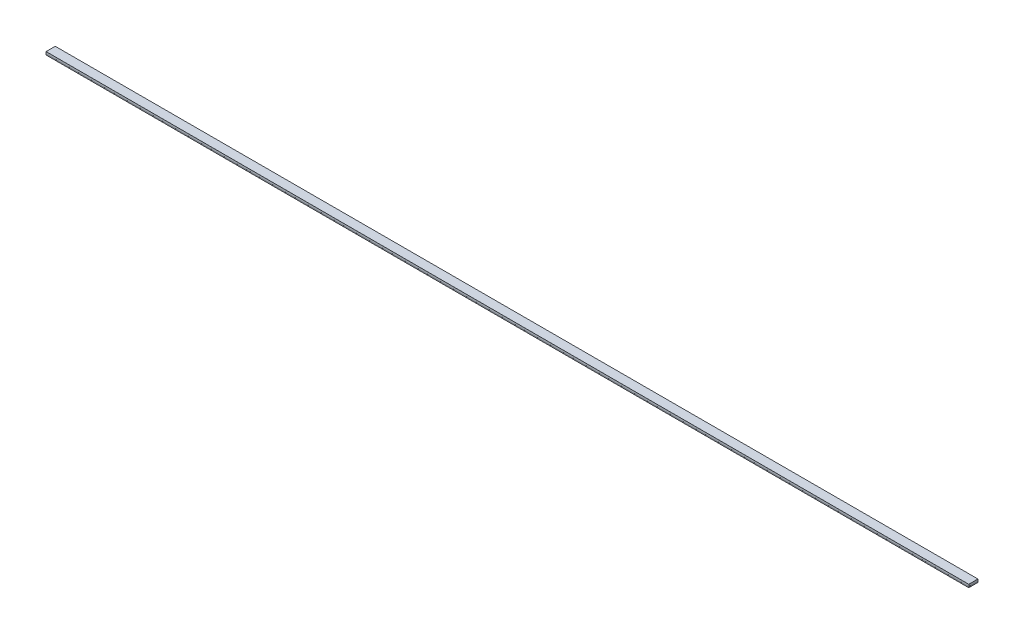
ISO-10303-21;
HEADER;
FILE_DESCRIPTION(('STEP AP214'),'2;1');
FILE_NAME('part.step','',(''),(''),'','','');
FILE_SCHEMA(('AUTOMOTIVE_DESIGN { 1 0 10303 214 1 1 1 1 }'));
ENDSEC;
DATA;
#1=APPLICATION_CONTEXT('core data for automotive mechanical design processes');
#2=APPLICATION_PROTOCOL_DEFINITION('international standard','automotive_design',2000,#1);
#3=PRODUCT_CONTEXT('',#1,'mechanical');
#4=PRODUCT('Part','Part','',(#3));
#5=PRODUCT_RELATED_PRODUCT_CATEGORY('part','',(#4));
#6=PRODUCT_DEFINITION_FORMATION('','',#4);
#7=PRODUCT_DEFINITION_CONTEXT('part definition',#1,'design');
#8=PRODUCT_DEFINITION('design','',#6,#7);
#9=PRODUCT_DEFINITION_SHAPE('','',#8);
#10=(LENGTH_UNIT() NAMED_UNIT(*) SI_UNIT(.MILLI.,.METRE.));
#11=(NAMED_UNIT(*) PLANE_ANGLE_UNIT() SI_UNIT($,.RADIAN.));
#12=(NAMED_UNIT(*) SI_UNIT($,.STERADIAN.) SOLID_ANGLE_UNIT());
#13=UNCERTAINTY_MEASURE_WITH_UNIT(LENGTH_MEASURE(1.E-05),#10,'distance_accuracy_value','');
#14=(GEOMETRIC_REPRESENTATION_CONTEXT(3) GLOBAL_UNCERTAINTY_ASSIGNED_CONTEXT((#13)) GLOBAL_UNIT_ASSIGNED_CONTEXT((#10,
#11,#12)) REPRESENTATION_CONTEXT('',''));
#15=CARTESIAN_POINT('',(0.,0.,0.));
#16=DIRECTION('',(0.,0.,1.));
#17=DIRECTION('',(1.,0.,0.));
#18=AXIS2_PLACEMENT_3D('',#15,#16,#17);
#19=CARTESIAN_POINT('',(0.,1.3,-5.));
#20=DIRECTION('',(0.,-1.,0.));
#21=DIRECTION('',(0.,0.,-1.));
#22=AXIS2_PLACEMENT_3D('',#19,#20,#21);
#23=PLANE('',#22);
#24=DIRECTION('',(0.,0.,-1.));
#25=VECTOR('',#24,1.);
#26=CARTESIAN_POINT('',(499.98,1.3,-0.02));
#27=LINE('',#26,#25);
#28=CARTESIAN_POINT('',(499.985,1.3,-0.0150000000000011));
#29=VERTEX_POINT('',#28);
#30=CARTESIAN_POINT('',(499.98,1.3,-4.98));
#31=VERTEX_POINT('',#30);
#32=EDGE_CURVE('E73',#29,#31,#27,.T.);
#33=ORIENTED_EDGE('',*,*,#32,.F.);
#34=DIRECTION('',(0.,0.,-1.));
#35=VECTOR('',#34,1.);
#36=CARTESIAN_POINT('',(499.99,1.3,-0.01));
#37=LINE('',#36,#35);
#38=CARTESIAN_POINT('',(499.99,1.3,-4.99));
#39=VERTEX_POINT('',#38);
#40=EDGE_CURVE('E136',#29,#39,#37,.T.);
#41=ORIENTED_EDGE('',*,*,#40,.T.);
#42=DIRECTION('',(-1.,0.,0.));
#43=VECTOR('',#42,1.);
#44=CARTESIAN_POINT('',(499.99,1.3,-4.99));
#45=LINE('',#44,#43);
#46=CARTESIAN_POINT('',(0.0164644660940719,1.3,-4.98353553390593));
#47=VERTEX_POINT('',#46);
#48=EDGE_CURVE('E159',#39,#47,#45,.T.);
#49=ORIENTED_EDGE('',*,*,#48,.T.);
#50=DIRECTION('',(-1.,0.,0.));
#51=VECTOR('',#50,1.);
#52=CARTESIAN_POINT('',(499.98,1.3,-4.98));
#53=LINE('',#52,#51);
#54=EDGE_CURVE('E62',#31,#47,#53,.T.);
#55=ORIENTED_EDGE('',*,*,#54,.F.);
#56=EDGE_LOOP('',(#33,#41,#49,#55));
#57=FACE_BOUND('',#56,.T.);
#58=ADVANCED_FACE('F40',(#57),#23,.F.);
#59=CARTESIAN_POINT('',(0.,1.3,0.));
#60=DIRECTION('',(1.,0.,0.));
#61=DIRECTION('',(0.,0.,-1.));
#62=AXIS2_PLACEMENT_3D('',#59,#60,#61);
#63=PLANE('',#62);
#64=DIRECTION('',(0.,0.,1.));
#65=VECTOR('',#64,1.);
#66=CARTESIAN_POINT('',(0.,0.3,0.));
#67=LINE('',#66,#65);
#68=CARTESIAN_POINT('',(0.,0.3,-5.));
#69=VERTEX_POINT('',#68);
#70=CARTESIAN_POINT('',(0.,0.3,0.));
#71=VERTEX_POINT('',#70);
#72=EDGE_CURVE('E233',#69,#71,#67,.T.);
#73=ORIENTED_EDGE('',*,*,#72,.F.);
#74=DIRECTION('',(0.,-1.,0.));
#75=VECTOR('',#74,1.);
#76=CARTESIAN_POINT('',(0.,1.3,-5.));
#77=LINE('',#76,#75);
#78=CARTESIAN_POINT('',(0.005,0.,-4.995));
#79=VERTEX_POINT('',#78);
#80=EDGE_CURVE('E290',#69,#79,#77,.T.);
#81=ORIENTED_EDGE('',*,*,#80,.T.);
#82=CARTESIAN_POINT('',(0.,0.,-5.));
#83=DIRECTION('',(0.,0.,1.));
#84=VECTOR('',#83,1.);
#85=LINE('',#82,#84);
#86=CARTESIAN_POINT('',(0.005,0.,-0.005));
#87=VERTEX_POINT('',#86);
#88=EDGE_CURVE('E234',#79,#87,#85,.T.);
#89=ORIENTED_EDGE('',*,*,#88,.T.);
#90=DIRECTION('',(0.,-1.,0.));
#91=VECTOR('',#90,1.);
#92=CARTESIAN_POINT('',(0.,1.3,0.));
#93=LINE('',#92,#91);
#94=EDGE_CURVE('E53',#71,#87,#93,.T.);
#95=ORIENTED_EDGE('',*,*,#94,.F.);
#96=EDGE_LOOP('',(#73,#81,#89,#95));
#97=FACE_BOUND('',#96,.T.);
#98=ADVANCED_FACE('F42',(#97),#63,.F.);
#99=CARTESIAN_POINT('',(0.,1.3,0.));
#100=DIRECTION('',(0.,0.,-1.));
#101=DIRECTION('',(-1.,0.,0.));
#102=AXIS2_PLACEMENT_3D('',#99,#100,#101);
#103=PLANE('',#102);
#104=DIRECTION('',(1.,0.,0.));
#105=VECTOR('',#104,1.);
#106=CARTESIAN_POINT('',(0.,0.3,0.));
#107=LINE('',#106,#105);
#108=CARTESIAN_POINT('',(500.,0.3,0.));
#109=VERTEX_POINT('',#108);
#110=EDGE_CURVE('E231',#71,#109,#107,.T.);
#111=ORIENTED_EDGE('',*,*,#110,.F.);
#112=ORIENTED_EDGE('',*,*,#94,.T.);
#113=CARTESIAN_POINT('',(0.,0.,0.));
#114=DIRECTION('',(1.,0.,0.));
#115=VECTOR('',#114,1.);
#116=LINE('',#113,#115);
#117=CARTESIAN_POINT('',(499.993535533906,0.,-0.00646446609407217));
#118=VERTEX_POINT('',#117);
#119=EDGE_CURVE('E297',#87,#118,#116,.T.);
#120=ORIENTED_EDGE('',*,*,#119,.T.);
#121=DIRECTION('',(0.,-1.,0.));
#122=VECTOR('',#121,1.);
#123=CARTESIAN_POINT('',(500.,1.3,0.));
#124=LINE('',#123,#122);
#125=EDGE_CURVE('E289',#109,#118,#124,.T.);
#126=ORIENTED_EDGE('',*,*,#125,.F.);
#127=EDGE_LOOP('',(#111,#112,#120,#126));
#128=FACE_BOUND('',#127,.T.);
#129=ADVANCED_FACE('F311',(#128),#103,.F.);
#130=CARTESIAN_POINT('',(500.,1.3,0.));
#131=DIRECTION('',(-1.,0.,0.));
#132=DIRECTION('',(0.,0.,1.));
#133=AXIS2_PLACEMENT_3D('',#130,#131,#132);
#134=PLANE('',#133);
#135=DIRECTION('',(0.,0.,-1.));
#136=VECTOR('',#135,1.);
#137=CARTESIAN_POINT('',(500.,0.3,0.));
#138=LINE('',#137,#136);
#139=CARTESIAN_POINT('',(500.,0.3,-5.));
#140=VERTEX_POINT('',#139);
#141=EDGE_CURVE('E229',#109,#140,#138,.T.);
#142=ORIENTED_EDGE('',*,*,#141,.F.);
#143=ORIENTED_EDGE('',*,*,#125,.T.);
#144=DIRECTION('',(0.,0.,-1.));
#145=VECTOR('',#144,1.);
#146=CARTESIAN_POINT('',(500.,0.,0.));
#147=LINE('',#146,#145);
#148=CARTESIAN_POINT('',(499.995,0.,-4.995));
#149=VERTEX_POINT('',#148);
#150=EDGE_CURVE('E293',#118,#149,#147,.T.);
#151=ORIENTED_EDGE('',*,*,#150,.T.);
#152=DIRECTION('',(0.,-1.,0.));
#153=VECTOR('',#152,1.);
#154=CARTESIAN_POINT('',(500.,1.3,-5.));
#155=LINE('',#154,#153);
#156=EDGE_CURVE('E281',#140,#149,#155,.T.);
#157=ORIENTED_EDGE('',*,*,#156,.F.);
#158=EDGE_LOOP('',(#142,#143,#151,#157));
#159=FACE_BOUND('',#158,.T.);
#160=ADVANCED_FACE('F272',(#159),#134,.F.);
#161=CARTESIAN_POINT('',(0.,1.3,-5.));
#162=DIRECTION('',(0.,0.,1.));
#163=DIRECTION('',(1.,0.,0.));
#164=AXIS2_PLACEMENT_3D('',#161,#162,#163);
#165=PLANE('',#164);
#166=DIRECTION('',(-1.,0.,0.));
#167=VECTOR('',#166,1.);
#168=CARTESIAN_POINT('',(0.,0.3,-5.));
#169=LINE('',#168,#167);
#170=EDGE_CURVE('E12',#140,#69,#169,.T.);
#171=ORIENTED_EDGE('',*,*,#170,.F.);
#172=ORIENTED_EDGE('',*,*,#156,.T.);
#173=CARTESIAN_POINT('',(500.,0.,-5.));
#174=DIRECTION('',(-1.,0.,0.));
#175=VECTOR('',#174,1.);
#176=LINE('',#173,#175);
#177=EDGE_CURVE('E296',#149,#79,#176,.T.);
#178=ORIENTED_EDGE('',*,*,#177,.T.);
#179=ORIENTED_EDGE('',*,*,#80,.F.);
#180=EDGE_LOOP('',(#171,#172,#178,#179));
#181=FACE_BOUND('',#180,.T.);
#182=ADVANCED_FACE('F267',(#181),#165,.F.);
#183=CARTESIAN_POINT('',(0.,0.,-5.));
#184=DIRECTION('',(0.,-1.,0.));
#185=DIRECTION('',(0.,0.,-1.));
#186=AXIS2_PLACEMENT_3D('',#183,#184,#185);
#187=PLANE('',#186);
#188=DIRECTION('',(0.,0.,1.));
#189=VECTOR('',#188,1.);
#190=CARTESIAN_POINT('',(499.99,0.,-4.99));
#191=LINE('',#190,#189);
#192=EDGE_CURVE('E467',#149,#118,#191,.T.);
#193=ORIENTED_EDGE('',*,*,#192,.F.);
#194=ORIENTED_EDGE('',*,*,#150,.F.);
#195=EDGE_LOOP('',(#193,#194));
#196=FACE_BOUND('',#195,.T.);
#197=ADVANCED_FACE('F261',(#196),#187,.T.);
#198=CARTESIAN_POINT('',(250.,0.3,-2.5));
#199=DIRECTION('',(0.,1.,0.));
#200=DIRECTION('',(0.,0.,1.));
#201=AXIS2_PLACEMENT_3D('',#198,#199,#200);
#202=PLANE('',#201);
#203=DIRECTION('',(0.,0.,-1.));
#204=VECTOR('',#203,1.);
#205=CARTESIAN_POINT('',(499.99,0.3,-0.01));
#206=LINE('',#205,#204);
#207=CARTESIAN_POINT('',(499.99,0.3,-0.01));
#208=VERTEX_POINT('',#207);
#209=CARTESIAN_POINT('',(499.99,0.3,-4.99));
#210=VERTEX_POINT('',#209);
#211=EDGE_CURVE('E224',#208,#210,#206,.T.);
#212=ORIENTED_EDGE('',*,*,#211,.F.);
#213=DIRECTION('',(1.,0.,0.));
#214=VECTOR('',#213,1.);
#215=CARTESIAN_POINT('',(0.01,0.3,-0.01));
#216=LINE('',#215,#214);
#217=CARTESIAN_POINT('',(0.01000000000001,0.3,-0.01));
#218=VERTEX_POINT('',#217);
#219=EDGE_CURVE('E222',#218,#208,#216,.T.);
#220=ORIENTED_EDGE('',*,*,#219,.F.);
#221=DIRECTION('',(0.,0.,1.));
#222=VECTOR('',#221,1.);
#223=CARTESIAN_POINT('',(0.01,0.3,-4.99));
#224=LINE('',#223,#222);
#225=CARTESIAN_POINT('',(0.01,0.3,-4.99));
#226=VERTEX_POINT('',#225);
#227=EDGE_CURVE('E147',#226,#218,#224,.T.);
#228=ORIENTED_EDGE('',*,*,#227,.F.);
#229=DIRECTION('',(-1.,0.,0.));
#230=VECTOR('',#229,1.);
#231=CARTESIAN_POINT('',(499.99,0.3,-4.99));
#232=LINE('',#231,#230);
#233=EDGE_CURVE('E218',#210,#226,#232,.T.);
#234=ORIENTED_EDGE('',*,*,#233,.F.);
#235=EDGE_LOOP('',(#212,#220,#228,#234));
#236=FACE_BOUND('',#235,.T.);
#237=ORIENTED_EDGE('',*,*,#72,.T.);
#238=ORIENTED_EDGE('',*,*,#110,.T.);
#239=ORIENTED_EDGE('',*,*,#141,.T.);
#240=ORIENTED_EDGE('',*,*,#170,.T.);
#241=EDGE_LOOP('',(#237,#238,#239,#240));
#242=FACE_BOUND('',#241,.T.);
#243=ADVANCED_FACE('F257',(#236,#242),#202,.T.);
#244=CARTESIAN_POINT('',(499.99,0.3,-4.99));
#245=DIRECTION('',(0.,0.,-1.));
#246=DIRECTION('',(-1.,0.,0.));
#247=AXIS2_PLACEMENT_3D('',#244,#245,#246);
#248=PLANE('',#247);
#249=ORIENTED_EDGE('',*,*,#48,.F.);
#250=DIRECTION('',(0.,1.,0.));
#251=VECTOR('',#250,1.);
#252=CARTESIAN_POINT('',(499.99,0.3,-4.99));
#253=LINE('',#252,#251);
#254=EDGE_CURVE('E227',#210,#39,#253,.T.);
#255=ORIENTED_EDGE('',*,*,#254,.F.);
#256=ORIENTED_EDGE('',*,*,#233,.T.);
#257=DIRECTION('',(0.,1.,0.));
#258=VECTOR('',#257,1.);
#259=CARTESIAN_POINT('',(0.01,0.3,-4.99));
#260=LINE('',#259,#258);
#261=EDGE_CURVE('E148',#226,#47,#260,.T.);
#262=ORIENTED_EDGE('',*,*,#261,.T.);
#263=EDGE_LOOP('',(#249,#255,#256,#262));
#264=FACE_BOUND('',#263,.T.);
#265=ADVANCED_FACE('F253',(#264),#248,.T.);
#266=CARTESIAN_POINT('',(499.99,0.3,-0.01));
#267=DIRECTION('',(1.,0.,0.));
#268=DIRECTION('',(0.,0.,-1.));
#269=AXIS2_PLACEMENT_3D('',#266,#267,#268);
#270=PLANE('',#269);
#271=ORIENTED_EDGE('',*,*,#40,.F.);
#272=DIRECTION('',(0.,1.,0.));
#273=VECTOR('',#272,1.);
#274=CARTESIAN_POINT('',(499.99,0.3,-0.01));
#275=LINE('',#274,#273);
#276=EDGE_CURVE('E130',#208,#29,#275,.T.);
#277=ORIENTED_EDGE('',*,*,#276,.F.);
#278=ORIENTED_EDGE('',*,*,#211,.T.);
#279=ORIENTED_EDGE('',*,*,#254,.T.);
#280=EDGE_LOOP('',(#271,#277,#278,#279));
#281=FACE_BOUND('',#280,.T.);
#282=ADVANCED_FACE('F256',(#281),#270,.T.);
#283=CARTESIAN_POINT('',(0.01,0.3,-0.01));
#284=DIRECTION('',(0.,0.,1.));
#285=DIRECTION('',(1.,0.,0.));
#286=AXIS2_PLACEMENT_3D('',#283,#284,#285);
#287=PLANE('',#286);
#288=CARTESIAN_POINT('',(0.02,1.3,-0.0199999999999996));
#289=DIRECTION('',(1.,0.,0.));
#290=VECTOR('',#289,1.);
#291=LINE('',#288,#290);
#292=CARTESIAN_POINT('',(0.0149999999999999,1.3,-0.0149999999999995));
#293=VERTEX_POINT('',#292);
#294=EDGE_CURVE('E123',#293,#29,#291,.T.);
#295=ORIENTED_EDGE('',*,*,#294,.F.);
#296=DIRECTION('',(0.,1.,0.));
#297=VECTOR('',#296,1.);
#298=CARTESIAN_POINT('',(0.01,0.3,-0.01));
#299=LINE('',#298,#297);
#300=EDGE_CURVE('E128',#218,#293,#299,.T.);
#301=ORIENTED_EDGE('',*,*,#300,.F.);
#302=ORIENTED_EDGE('',*,*,#219,.T.);
#303=ORIENTED_EDGE('',*,*,#276,.T.);
#304=EDGE_LOOP('',(#295,#301,#302,#303));
#305=FACE_BOUND('',#304,.T.);
#306=ADVANCED_FACE('F126',(#305),#287,.T.);
#307=CARTESIAN_POINT('',(0.01,0.3,-4.99));
#308=DIRECTION('',(-1.,0.,0.));
#309=DIRECTION('',(0.,0.,1.));
#310=AXIS2_PLACEMENT_3D('',#307,#308,#309);
#311=PLANE('',#310);
#312=CARTESIAN_POINT('',(0.0199999999999996,1.3,-4.98));
#313=DIRECTION('',(0.,0.,1.));
#314=VECTOR('',#313,1.);
#315=LINE('',#312,#314);
#316=EDGE_CURVE('E137',#47,#293,#315,.T.);
#317=ORIENTED_EDGE('',*,*,#316,.F.);
#318=ORIENTED_EDGE('',*,*,#261,.F.);
#319=ORIENTED_EDGE('',*,*,#227,.T.);
#320=ORIENTED_EDGE('',*,*,#300,.T.);
#321=EDGE_LOOP('',(#317,#318,#319,#320));
#322=FACE_BOUND('',#321,.T.);
#323=ADVANCED_FACE('F143',(#322),#311,.T.);
#324=CARTESIAN_POINT('',(499.98,1.38,-0.02));
#325=DIRECTION('',(-1.,0.,0.));
#326=DIRECTION('',(0.,0.,1.));
#327=AXIS2_PLACEMENT_3D('',#324,#325,#326);
#328=PLANE('',#327);
#329=ORIENTED_EDGE('',*,*,#32,.T.);
#330=DIRECTION('',(0.,-1.,0.));
#331=VECTOR('',#330,1.);
#332=CARTESIAN_POINT('',(499.98,1.38,-4.98));
#333=LINE('',#332,#331);
#334=CARTESIAN_POINT('',(499.98,1.38,-4.98));
#335=VERTEX_POINT('',#334);
#336=EDGE_CURVE('E165',#335,#31,#333,.T.);
#337=ORIENTED_EDGE('',*,*,#336,.F.);
#338=DIRECTION('',(0.,0.,-1.));
#339=VECTOR('',#338,1.);
#340=CARTESIAN_POINT('',(499.98,1.38,-0.02));
#341=LINE('',#340,#339);
#342=CARTESIAN_POINT('',(499.98,1.38,-0.02));
#343=VERTEX_POINT('',#342);
#344=EDGE_CURVE('E202',#343,#335,#341,.T.);
#345=ORIENTED_EDGE('',*,*,#344,.F.);
#346=DIRECTION('',(0.,-1.,0.));
#347=VECTOR('',#346,1.);
#348=CARTESIAN_POINT('',(499.98,1.38,-0.02));
#349=LINE('',#348,#347);
#350=EDGE_CURVE('E163',#343,#29,#349,.T.);
#351=ORIENTED_EDGE('',*,*,#350,.T.);
#352=EDGE_LOOP('',(#329,#337,#345,#351));
#353=FACE_BOUND('',#352,.T.);
#354=ADVANCED_FACE('F250',(#353),#328,.F.);
#355=CARTESIAN_POINT('',(499.98,1.38,-4.98));
#356=DIRECTION('',(0.,0.,1.));
#357=DIRECTION('',(1.,0.,0.));
#358=AXIS2_PLACEMENT_3D('',#355,#356,#357);
#359=PLANE('',#358);
#360=ORIENTED_EDGE('',*,*,#54,.T.);
#361=DIRECTION('',(0.,-1.,0.));
#362=VECTOR('',#361,1.);
#363=CARTESIAN_POINT('',(0.0199999999999996,1.38,-4.98));
#364=LINE('',#363,#362);
#365=CARTESIAN_POINT('',(0.0199999999999996,1.38,-4.98));
#366=VERTEX_POINT('',#365);
#367=EDGE_CURVE('E158',#366,#47,#364,.T.);
#368=ORIENTED_EDGE('',*,*,#367,.F.);
#369=DIRECTION('',(-1.,0.,0.));
#370=VECTOR('',#369,1.);
#371=CARTESIAN_POINT('',(499.98,1.38,-4.98));
#372=LINE('',#371,#370);
#373=EDGE_CURVE('E205',#335,#366,#372,.T.);
#374=ORIENTED_EDGE('',*,*,#373,.F.);
#375=ORIENTED_EDGE('',*,*,#336,.T.);
#376=EDGE_LOOP('',(#360,#368,#374,#375));
#377=FACE_BOUND('',#376,.T.);
#378=ADVANCED_FACE('F191',(#377),#359,.F.);
#379=CARTESIAN_POINT('',(0.0199999999999996,1.38,-4.98));
#380=DIRECTION('',(1.,0.,0.));
#381=DIRECTION('',(0.,0.,-1.));
#382=AXIS2_PLACEMENT_3D('',#379,#380,#381);
#383=PLANE('',#382);
#384=ORIENTED_EDGE('',*,*,#316,.T.);
#385=DIRECTION('',(0.,-1.,0.));
#386=VECTOR('',#385,1.);
#387=CARTESIAN_POINT('',(0.02,1.38,-0.0199999999999996));
#388=LINE('',#387,#386);
#389=CARTESIAN_POINT('',(0.02,1.38,-0.0199999999999996));
#390=VERTEX_POINT('',#389);
#391=EDGE_CURVE('E156',#390,#293,#388,.T.);
#392=ORIENTED_EDGE('',*,*,#391,.F.);
#393=DIRECTION('',(0.,0.,1.));
#394=VECTOR('',#393,1.);
#395=CARTESIAN_POINT('',(0.0199999999999996,1.38,-4.98));
#396=LINE('',#395,#394);
#397=EDGE_CURVE('E372',#366,#390,#396,.T.);
#398=ORIENTED_EDGE('',*,*,#397,.F.);
#399=ORIENTED_EDGE('',*,*,#367,.T.);
#400=EDGE_LOOP('',(#384,#392,#398,#399));
#401=FACE_BOUND('',#400,.T.);
#402=ADVANCED_FACE('F154',(#401),#383,.F.);
#403=CARTESIAN_POINT('',(0.02,1.38,-0.0199999999999996));
#404=DIRECTION('',(0.,0.,-1.));
#405=DIRECTION('',(-1.,0.,0.));
#406=AXIS2_PLACEMENT_3D('',#403,#404,#405);
#407=PLANE('',#406);
#408=ORIENTED_EDGE('',*,*,#294,.T.);
#409=ORIENTED_EDGE('',*,*,#350,.F.);
#410=DIRECTION('',(1.,0.,0.));
#411=VECTOR('',#410,1.);
#412=CARTESIAN_POINT('',(0.02,1.38,-0.0199999999999996));
#413=LINE('',#412,#411);
#414=EDGE_CURVE('E85',#390,#343,#413,.T.);
#415=ORIENTED_EDGE('',*,*,#414,.F.);
#416=ORIENTED_EDGE('',*,*,#391,.T.);
#417=EDGE_LOOP('',(#408,#409,#415,#416));
#418=FACE_BOUND('',#417,.T.);
#419=ADVANCED_FACE('F162',(#418),#407,.F.);
#420=CARTESIAN_POINT('',(0.,1.38,0.));
#421=DIRECTION('',(0.,1.,0.));
#422=DIRECTION('',(0.,0.,1.));
#423=AXIS2_PLACEMENT_3D('',#420,#421,#422);
#424=PLANE('',#423);
#425=ORIENTED_EDGE('',*,*,#344,.T.);
#426=ORIENTED_EDGE('',*,*,#373,.T.);
#427=ORIENTED_EDGE('',*,*,#397,.T.);
#428=ORIENTED_EDGE('',*,*,#414,.T.);
#429=EDGE_LOOP('',(#425,#426,#427,#428));
#430=FACE_BOUND('',#429,.T.);
#431=ADVANCED_FACE('F186',(#430),#424,.T.);
#432=CARTESIAN_POINT('',(499.99,-0.13,-0.01));
#433=DIRECTION('',(0.,0.,-1.));
#434=DIRECTION('',(-1.,0.,0.));
#435=AXIS2_PLACEMENT_3D('',#432,#433,#434);
#436=PLANE('',#435);
#437=ORIENTED_EDGE('',*,*,#119,.F.);
#438=DIRECTION('',(0.,1.,0.));
#439=VECTOR('',#438,1.);
#440=CARTESIAN_POINT('',(0.01,-0.13,-0.01));
#441=LINE('',#440,#439);
#442=CARTESIAN_POINT('',(0.005,-0.13,-0.005));
#443=VERTEX_POINT('',#442);
#444=EDGE_CURVE('E207',#443,#87,#441,.T.);
#445=ORIENTED_EDGE('',*,*,#444,.F.);
#446=CARTESIAN_POINT('',(500.,-0.13,0.));
#447=DIRECTION('',(-1.,0.,0.));
#448=VECTOR('',#447,1.);
#449=LINE('',#446,#448);
#450=CARTESIAN_POINT('',(499.995,-0.13,-0.005));
#451=VERTEX_POINT('',#450);
#452=EDGE_CURVE('E469',#451,#443,#449,.T.);
#453=ORIENTED_EDGE('',*,*,#452,.F.);
#454=DIRECTION('',(0.,1.,0.));
#455=VECTOR('',#454,1.);
#456=CARTESIAN_POINT('',(499.99,-0.13,-0.01));
#457=LINE('',#456,#455);
#458=EDGE_CURVE('E378',#451,#118,#457,.T.);
#459=ORIENTED_EDGE('',*,*,#458,.T.);
#460=EDGE_LOOP('',(#437,#445,#453,#459));
#461=FACE_BOUND('',#460,.T.);
#462=ADVANCED_FACE('F387',(#461),#436,.F.);
#463=CARTESIAN_POINT('',(0.01,-0.13,-0.01));
#464=DIRECTION('',(1.,0.,0.));
#465=DIRECTION('',(0.,0.,-1.));
#466=AXIS2_PLACEMENT_3D('',#463,#464,#465);
#467=PLANE('',#466);
#468=ORIENTED_EDGE('',*,*,#88,.F.);
#469=DIRECTION('',(0.,1.,0.));
#470=VECTOR('',#469,1.);
#471=CARTESIAN_POINT('',(0.01,-0.13,-4.99));
#472=LINE('',#471,#470);
#473=CARTESIAN_POINT('',(0.005,-0.13,-4.995));
#474=VERTEX_POINT('',#473);
#475=EDGE_CURVE('E212',#474,#79,#472,.T.);
#476=ORIENTED_EDGE('',*,*,#475,.F.);
#477=CARTESIAN_POINT('',(0.,-0.13,0.));
#478=DIRECTION('',(0.,0.,-1.));
#479=VECTOR('',#478,1.);
#480=LINE('',#477,#479);
#481=EDGE_CURVE('E418',#443,#474,#480,.T.);
#482=ORIENTED_EDGE('',*,*,#481,.F.);
#483=ORIENTED_EDGE('',*,*,#444,.T.);
#484=EDGE_LOOP('',(#468,#476,#482,#483));
#485=FACE_BOUND('',#484,.T.);
#486=ADVANCED_FACE('F396',(#485),#467,.F.);
#487=CARTESIAN_POINT('',(0.01,-0.13,-4.99));
#488=DIRECTION('',(0.,0.,1.));
#489=DIRECTION('',(1.,0.,0.));
#490=AXIS2_PLACEMENT_3D('',#487,#488,#489);
#491=PLANE('',#490);
#492=ORIENTED_EDGE('',*,*,#177,.F.);
#493=DIRECTION('',(0.,1.,0.));
#494=VECTOR('',#493,1.);
#495=CARTESIAN_POINT('',(499.99,-0.13,-4.99));
#496=LINE('',#495,#494);
#497=CARTESIAN_POINT('',(499.995,-0.13,-4.995));
#498=VERTEX_POINT('',#497);
#499=EDGE_CURVE('E381',#498,#149,#496,.T.);
#500=ORIENTED_EDGE('',*,*,#499,.F.);
#501=CARTESIAN_POINT('',(0.,-0.13,-5.));
#502=DIRECTION('',(1.,0.,0.));
#503=VECTOR('',#502,1.);
#504=LINE('',#501,#503);
#505=EDGE_CURVE('E435',#474,#498,#504,.T.);
#506=ORIENTED_EDGE('',*,*,#505,.F.);
#507=ORIENTED_EDGE('',*,*,#475,.T.);
#508=EDGE_LOOP('',(#492,#500,#506,#507));
#509=FACE_BOUND('',#508,.T.);
#510=ADVANCED_FACE('F439',(#509),#491,.F.);
#511=CARTESIAN_POINT('',(499.99,-0.13,-4.99));
#512=DIRECTION('',(-1.,0.,0.));
#513=DIRECTION('',(0.,0.,1.));
#514=AXIS2_PLACEMENT_3D('',#511,#512,#513);
#515=PLANE('',#514);
#516=ORIENTED_EDGE('',*,*,#192,.T.);
#517=ORIENTED_EDGE('',*,*,#458,.F.);
#518=CARTESIAN_POINT('',(500.,-0.13,-5.));
#519=DIRECTION('',(0.,0.,1.));
#520=VECTOR('',#519,1.);
#521=LINE('',#518,#520);
#522=EDGE_CURVE('E382',#498,#451,#521,.T.);
#523=ORIENTED_EDGE('',*,*,#522,.F.);
#524=ORIENTED_EDGE('',*,*,#499,.T.);
#525=EDGE_LOOP('',(#516,#517,#523,#524));
#526=FACE_BOUND('',#525,.T.);
#527=ADVANCED_FACE('F447',(#526),#515,.F.);
#528=CARTESIAN_POINT('',(500.,-0.23,-5.));
#529=DIRECTION('',(-1.,0.,0.));
#530=DIRECTION('',(0.,0.,1.));
#531=AXIS2_PLACEMENT_3D('',#528,#529,#530);
#532=PLANE('',#531);
#533=ORIENTED_EDGE('',*,*,#522,.T.);
#534=DIRECTION('',(0.,1.,0.));
#535=VECTOR('',#534,1.);
#536=CARTESIAN_POINT('',(500.,-0.23,0.));
#537=LINE('',#536,#535);
#538=CARTESIAN_POINT('',(500.,-0.23,0.));
#539=VERTEX_POINT('',#538);
#540=EDGE_CURVE('E470',#539,#451,#537,.T.);
#541=ORIENTED_EDGE('',*,*,#540,.F.);
#542=DIRECTION('',(0.,0.,1.));
#543=VECTOR('',#542,1.);
#544=CARTESIAN_POINT('',(500.,-0.23,-5.));
#545=LINE('',#544,#543);
#546=CARTESIAN_POINT('',(500.,-0.23,-5.));
#547=VERTEX_POINT('',#546);
#548=EDGE_CURVE('E711',#547,#539,#545,.T.);
#549=ORIENTED_EDGE('',*,*,#548,.F.);
#550=DIRECTION('',(0.,1.,0.));
#551=VECTOR('',#550,1.);
#552=CARTESIAN_POINT('',(500.,-0.23,-5.));
#553=LINE('',#552,#551);
#554=EDGE_CURVE('E723',#547,#498,#553,.T.);
#555=ORIENTED_EDGE('',*,*,#554,.T.);
#556=EDGE_LOOP('',(#533,#541,#549,#555));
#557=FACE_BOUND('',#556,.T.);
#558=ADVANCED_FACE('F520',(#557),#532,.F.);
#559=CARTESIAN_POINT('',(500.,-0.23,0.));
#560=DIRECTION('',(0.,0.,-1.));
#561=DIRECTION('',(-1.,0.,0.));
#562=AXIS2_PLACEMENT_3D('',#559,#560,#561);
#563=PLANE('',#562);
#564=ORIENTED_EDGE('',*,*,#452,.T.);
#565=DIRECTION('',(0.,1.,0.));
#566=VECTOR('',#565,1.);
#567=CARTESIAN_POINT('',(0.,-0.23,0.));
#568=LINE('',#567,#566);
#569=CARTESIAN_POINT('',(0.,-0.23,0.));
#570=VERTEX_POINT('',#569);
#571=EDGE_CURVE('E477',#570,#443,#568,.T.);
#572=ORIENTED_EDGE('',*,*,#571,.F.);
#573=DIRECTION('',(-1.,0.,0.));
#574=VECTOR('',#573,1.);
#575=CARTESIAN_POINT('',(500.,-0.23,0.));
#576=LINE('',#575,#574);
#577=EDGE_CURVE('E714',#539,#570,#576,.T.);
#578=ORIENTED_EDGE('',*,*,#577,.F.);
#579=ORIENTED_EDGE('',*,*,#540,.T.);
#580=EDGE_LOOP('',(#564,#572,#578,#579));
#581=FACE_BOUND('',#580,.T.);
#582=ADVANCED_FACE('F515',(#581),#563,.F.);
#583=CARTESIAN_POINT('',(0.,-0.23,0.));
#584=DIRECTION('',(1.,0.,0.));
#585=DIRECTION('',(0.,0.,-1.));
#586=AXIS2_PLACEMENT_3D('',#583,#584,#585);
#587=PLANE('',#586);
#588=ORIENTED_EDGE('',*,*,#481,.T.);
#589=DIRECTION('',(0.,1.,0.));
#590=VECTOR('',#589,1.);
#591=CARTESIAN_POINT('',(0.,-0.23,-5.));
#592=LINE('',#591,#590);
#593=CARTESIAN_POINT('',(0.,-0.23,-5.));
#594=VERTEX_POINT('',#593);
#595=EDGE_CURVE('E484',#594,#474,#592,.T.);
#596=ORIENTED_EDGE('',*,*,#595,.F.);
#597=DIRECTION('',(0.,0.,-1.));
#598=VECTOR('',#597,1.);
#599=CARTESIAN_POINT('',(0.,-0.23,0.));
#600=LINE('',#599,#598);
#601=EDGE_CURVE('E736',#570,#594,#600,.T.);
#602=ORIENTED_EDGE('',*,*,#601,.F.);
#603=ORIENTED_EDGE('',*,*,#571,.T.);
#604=EDGE_LOOP('',(#588,#596,#602,#603));
#605=FACE_BOUND('',#604,.T.);
#606=ADVANCED_FACE('F505',(#605),#587,.F.);
#607=CARTESIAN_POINT('',(0.,-0.23,-5.));
#608=DIRECTION('',(0.,0.,1.));
#609=DIRECTION('',(1.,0.,0.));
#610=AXIS2_PLACEMENT_3D('',#607,#608,#609);
#611=PLANE('',#610);
#612=ORIENTED_EDGE('',*,*,#505,.T.);
#613=ORIENTED_EDGE('',*,*,#554,.F.);
#614=DIRECTION('',(1.,0.,0.));
#615=VECTOR('',#614,1.);
#616=CARTESIAN_POINT('',(0.,-0.23,-5.));
#617=LINE('',#616,#615);
#618=EDGE_CURVE('E717',#594,#547,#617,.T.);
#619=ORIENTED_EDGE('',*,*,#618,.F.);
#620=ORIENTED_EDGE('',*,*,#595,.T.);
#621=EDGE_LOOP('',(#612,#613,#619,#620));
#622=FACE_BOUND('',#621,.T.);
#623=ADVANCED_FACE('F514',(#622),#611,.F.);
#624=CARTESIAN_POINT('',(0.,-0.23,0.));
#625=DIRECTION('',(0.,-1.,0.));
#626=DIRECTION('',(0.,0.,-1.));
#627=AXIS2_PLACEMENT_3D('',#624,#625,#626);
#628=PLANE('',#627);
#629=ORIENTED_EDGE('',*,*,#548,.T.);
#630=ORIENTED_EDGE('',*,*,#577,.T.);
#631=ORIENTED_EDGE('',*,*,#601,.T.);
#632=ORIENTED_EDGE('',*,*,#618,.T.);
#633=EDGE_LOOP('',(#629,#630,#631,#632));
#634=FACE_BOUND('',#633,.T.);
#635=ADVANCED_FACE('F689',(#634),#628,.T.);
#636=CLOSED_SHELL('',(#58,#98,#129,#160,#182,#197,#243,#265,#282,#306,#323,#354,#378,#402,#419,
#431,#462,#486,#510,#527,#558,#582,#606,#623,#635));
#637=MANIFOLD_SOLID_BREP('B2',#636);
#638=ADVANCED_BREP_SHAPE_REPRESENTATION('',(#18,#637),#14);
#639=SHAPE_DEFINITION_REPRESENTATION(#9,#638);
ENDSEC;
END-ISO-10303-21;
